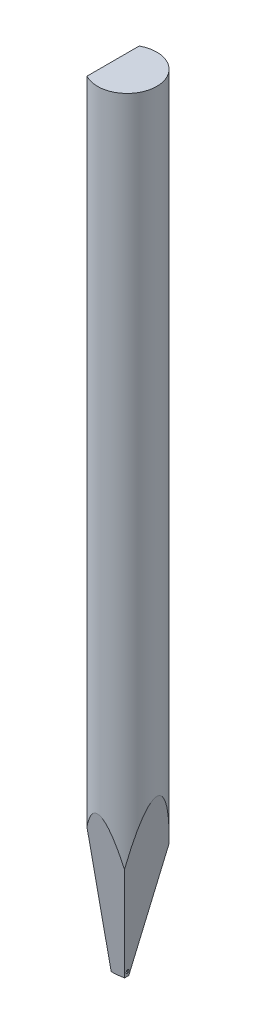
ISO-10303-21;
HEADER;
FILE_DESCRIPTION(('STEP AP214'),'2;1');
FILE_NAME('part.step','',(''),(''),'','','');
FILE_SCHEMA(('AUTOMOTIVE_DESIGN { 1 0 10303 214 1 1 1 1 }'));
ENDSEC;
DATA;
#1=APPLICATION_CONTEXT('core data for automotive mechanical design processes');
#2=APPLICATION_PROTOCOL_DEFINITION('international standard','automotive_design',2000,#1);
#3=PRODUCT_CONTEXT('',#1,'mechanical');
#4=PRODUCT('Part','Part','',(#3));
#5=PRODUCT_RELATED_PRODUCT_CATEGORY('part','',(#4));
#6=PRODUCT_DEFINITION_FORMATION('','',#4);
#7=PRODUCT_DEFINITION_CONTEXT('part definition',#1,'design');
#8=PRODUCT_DEFINITION('design','',#6,#7);
#9=PRODUCT_DEFINITION_SHAPE('','',#8);
#10=(LENGTH_UNIT() NAMED_UNIT(*) SI_UNIT(.MILLI.,.METRE.));
#11=(NAMED_UNIT(*) PLANE_ANGLE_UNIT() SI_UNIT($,.RADIAN.));
#12=(NAMED_UNIT(*) SI_UNIT($,.STERADIAN.) SOLID_ANGLE_UNIT());
#13=UNCERTAINTY_MEASURE_WITH_UNIT(LENGTH_MEASURE(1.E-05),#10,'distance_accuracy_value','');
#14=(GEOMETRIC_REPRESENTATION_CONTEXT(3) GLOBAL_UNCERTAINTY_ASSIGNED_CONTEXT((#13)) GLOBAL_UNIT_ASSIGNED_CONTEXT((#10,
#11,#12)) REPRESENTATION_CONTEXT('',''));
#15=CARTESIAN_POINT('',(0.,0.,0.));
#16=DIRECTION('',(0.,0.,1.));
#17=DIRECTION('',(1.,0.,0.));
#18=AXIS2_PLACEMENT_3D('',#15,#16,#17);
#19=CARTESIAN_POINT('',(26.8738719491216,0.,0.0508));
#20=DIRECTION('',(0.,-0.173648177666931,0.984807753012208));
#21=DIRECTION('',(0.,-0.984807753012208,-0.173648177666931));
#22=AXIS2_PLACEMENT_3D('',#19,#20,#21);
#23=PLANE('',#22);
#24=CARTESIAN_POINT('',(-0.35052,0.0254,0.0552787053099968));
#25=DIRECTION('',(0.,-0.173648177666931,0.984807753012208));
#26=DIRECTION('',(0.,-0.984807753012208,-0.173648177666931));
#27=AXIS2_PLACEMENT_3D('',#24,#25,#26);
#28=ELLIPSE('',#27,0.0257918359418979,0.0254);
#29=CARTESIAN_POINT('',(-0.35052,0.,0.0508000000000018));
#30=VERTEX_POINT('',#29);
#31=CARTESIAN_POINT('',(-0.37592,0.0254,0.0552787053099968));
#32=VERTEX_POINT('',#31);
#33=EDGE_CURVE('E204',#30,#32,#28,.F.);
#34=ORIENTED_EDGE('',*,*,#33,.F.);
#35=DIRECTION('',(-1.,0.,0.));
#36=VECTOR('',#35,1.);
#37=CARTESIAN_POINT('',(26.8738719491216,0.,0.0508));
#38=LINE('',#37,#36);
#39=CARTESIAN_POINT('',(-0.274319999999996,0.,0.0508000000000001));
#40=VERTEX_POINT('',#39);
#41=EDGE_CURVE('E268',#40,#30,#38,.T.);
#42=ORIENTED_EDGE('',*,*,#41,.F.);
#43=DIRECTION('',(-0.98997002855162,-0.139131214142995,-0.0245325869121374));
#44=VECTOR('',#43,1.);
#45=CARTESIAN_POINT('',(26.3320118858664,3.73927609160853,0.710135263268685));
#46=LINE('',#45,#44);
#47=CARTESIAN_POINT('',(-0.0138656438636779,0.0366044726132731,0.0572543561363243));
#48=VERTEX_POINT('',#47);
#49=EDGE_CURVE('E265',#48,#40,#46,.T.);
#50=ORIENTED_EDGE('',*,*,#49,.F.);
#51=DIRECTION('',(-0.171087869746036,-0.970287525247814,-0.171087869746036));
#52=VECTOR('',#51,1.);
#53=CARTESIAN_POINT('',(0.766901483986011,4.46455489014234,0.838021483986017));
#54=LINE('',#53,#52);
#55=CARTESIAN_POINT('',(0.523678555180163,3.08516911589156,0.594798555180167));
#56=VERTEX_POINT('',#55);
#57=EDGE_CURVE('E262',#56,#48,#54,.T.);
#58=ORIENTED_EDGE('',*,*,#57,.F.);
#59=CARTESIAN_POINT('',(0.,-0.288101116436578,0.));
#60=DIRECTION('',(0.,-0.173648177666931,0.984807753012208));
#61=DIRECTION('',(0.,-0.984807753012208,-0.173648177666931));
#62=AXIS2_PLACEMENT_3D('',#59,#60,#61);
#63=ELLIPSE('',#62,4.56371043248163,0.792479999999998);
#64=CARTESIAN_POINT('',(-0.37592,3.66844093071415,0.69764511322018));
#65=VERTEX_POINT('',#64);
#66=EDGE_CURVE('E273',#56,#65,#63,.T.);
#67=ORIENTED_EDGE('',*,*,#66,.T.);
#68=DIRECTION('',(0.,0.984807753012208,0.173648177666931));
#69=VECTOR('',#68,1.);
#70=CARTESIAN_POINT('',(-0.37592,20.251112252608,3.62161747949059));
#71=LINE('',#70,#69);
#72=EDGE_CURVE('E287',#32,#65,#71,.T.);
#73=ORIENTED_EDGE('',*,*,#72,.F.);
#74=EDGE_LOOP('',(#34,#42,#50,#58,#67,#73));
#75=FACE_BOUND('',#74,.T.);
#76=ADVANCED_FACE('F46',(#75),#23,.T.);
#77=CARTESIAN_POINT('',(26.8738719491216,0.,-0.0508));
#78=DIRECTION('',(0.,-0.173648177666931,-0.984807753012208));
#79=DIRECTION('',(0.,0.984807753012208,-0.173648177666931));
#80=AXIS2_PLACEMENT_3D('',#77,#78,#79);
#81=PLANE('',#80);
#82=CARTESIAN_POINT('',(-0.35052,0.0254,-0.0552787053099968));
#83=DIRECTION('',(0.,-0.173648177666931,-0.984807753012208));
#84=DIRECTION('',(0.,0.984807753012208,-0.173648177666931));
#85=AXIS2_PLACEMENT_3D('',#82,#83,#84);
#86=ELLIPSE('',#85,0.0257918359418979,0.0254);
#87=CARTESIAN_POINT('',(-0.37592,0.0254,-0.0552787053099968));
#88=VERTEX_POINT('',#87);
#89=CARTESIAN_POINT('',(-0.35052,0.,-0.0508000000000018));
#90=VERTEX_POINT('',#89);
#91=EDGE_CURVE('E201',#88,#90,#86,.F.);
#92=ORIENTED_EDGE('',*,*,#91,.F.);
#93=DIRECTION('',(0.,-0.984807753012208,0.173648177666931));
#94=VECTOR('',#93,1.);
#95=CARTESIAN_POINT('',(-0.37592,20.5255765703836,-3.67001294395617));
#96=LINE('',#95,#94);
#97=CARTESIAN_POINT('',(-0.37592,3.66844093071414,-0.69764511322018));
#98=VERTEX_POINT('',#97);
#99=EDGE_CURVE('E193',#98,#88,#96,.T.);
#100=ORIENTED_EDGE('',*,*,#99,.F.);
#101=CARTESIAN_POINT('',(0.,-0.288101116436578,0.));
#102=DIRECTION('',(0.,-0.173648177666931,-0.984807753012208));
#103=DIRECTION('',(0.,-0.984807753012208,0.173648177666931));
#104=AXIS2_PLACEMENT_3D('',#101,#102,#103);
#105=ELLIPSE('',#104,4.56371043248163,0.792479999999998);
#106=CARTESIAN_POINT('',(0.523678555180163,3.08516911589156,-0.594798555180167));
#107=VERTEX_POINT('',#106);
#108=EDGE_CURVE('E276',#98,#107,#105,.T.);
#109=ORIENTED_EDGE('',*,*,#108,.T.);
#110=DIRECTION('',(0.171087869746036,0.970287525247814,-0.171087869746036));
#111=VECTOR('',#110,1.);
#112=CARTESIAN_POINT('',(0.766901483986011,4.46455489014234,-0.838021483986017));
#113=LINE('',#112,#111);
#114=CARTESIAN_POINT('',(-0.0138656438636779,0.0366044726132731,-0.0572543561363243));
#115=VERTEX_POINT('',#114);
#116=EDGE_CURVE('E290',#115,#107,#113,.T.);
#117=ORIENTED_EDGE('',*,*,#116,.F.);
#118=DIRECTION('',(0.98997002855162,0.139131214142995,-0.0245325869121374));
#119=VECTOR('',#118,1.);
#120=CARTESIAN_POINT('',(26.3320118858664,3.73927609160853,-0.710135263268685));
#121=LINE('',#120,#119);
#122=CARTESIAN_POINT('',(-0.274319999999996,0.,-0.0508000000000001));
#123=VERTEX_POINT('',#122);
#124=EDGE_CURVE('E293',#123,#115,#121,.T.);
#125=ORIENTED_EDGE('',*,*,#124,.F.);
#126=DIRECTION('',(-1.,0.,0.));
#127=VECTOR('',#126,1.);
#128=CARTESIAN_POINT('',(26.8738719491216,0.,-0.0508));
#129=LINE('',#128,#127);
#130=EDGE_CURVE('E270',#123,#90,#129,.T.);
#131=ORIENTED_EDGE('',*,*,#130,.T.);
#132=EDGE_LOOP('',(#92,#100,#109,#117,#125,#131));
#133=FACE_BOUND('',#132,.T.);
#134=ADVANCED_FACE('F382',(#133),#81,.T.);
#135=CARTESIAN_POINT('',(-0.27432,0.,27.2760283406468));
#136=DIRECTION('',(-0.139173100960066,0.99026806874157,0.));
#137=DIRECTION('',(-0.99026806874157,-0.139173100960066,0.));
#138=AXIS2_PLACEMENT_3D('',#135,#136,#137);
#139=PLANE('',#138);
#140=DIRECTION('',(-0.99026806874157,-0.139173100960066,0.));
#141=VECTOR('',#140,1.);
#142=CARTESIAN_POINT('',(-0.27432,0.,0.0253999999999983));
#143=LINE('',#142,#141);
#144=CARTESIAN_POINT('',(-0.145800064,0.018062299081338,0.0253999999999992));
#145=VERTEX_POINT('',#144);
#146=CARTESIAN_POINT('',(-0.254691435266474,0.00275861487165988,0.0254));
#147=VERTEX_POINT('',#146);
#148=EDGE_CURVE('E248',#145,#147,#143,.T.);
#149=ORIENTED_EDGE('',*,*,#148,.F.);
#150=DIRECTION('',(0.,0.,1.));
#151=VECTOR('',#150,1.);
#152=CARTESIAN_POINT('',(-0.145800064,0.018062299081338,27.2760283406468));
#153=LINE('',#152,#151);
#154=CARTESIAN_POINT('',(-0.145800064,0.018062299081338,-0.0253999999999992));
#155=VERTEX_POINT('',#154);
#156=EDGE_CURVE('E304',#155,#145,#153,.T.);
#157=ORIENTED_EDGE('',*,*,#156,.F.);
#158=DIRECTION('',(-0.99026806874157,-0.139173100960066,0.));
#159=VECTOR('',#158,1.);
#160=CARTESIAN_POINT('',(-0.27432,0.,-0.0253999999999983));
#161=LINE('',#160,#159);
#162=CARTESIAN_POINT('',(-0.254691435266474,0.00275861487165988,-0.0254));
#163=VERTEX_POINT('',#162);
#164=EDGE_CURVE('E244',#155,#163,#161,.T.);
#165=ORIENTED_EDGE('',*,*,#164,.T.);
#166=CARTESIAN_POINT('',(-2.43404817183527,-0.30353,0.));
#167=DIRECTION('',(-0.139173100960066,0.99026806874157,0.));
#168=DIRECTION('',(-0.99026806874157,-0.139173100960066,0.));
#169=AXIS2_PLACEMENT_3D('',#166,#167,#168);
#170=ELLIPSE('',#169,2.20832903686027,0.30734);
#171=CARTESIAN_POINT('',(-0.27432,0.,-0.0482432865795759));
#172=VERTEX_POINT('',#171);
#173=EDGE_CURVE('E296',#163,#172,#170,.T.);
#174=ORIENTED_EDGE('',*,*,#173,.T.);
#175=DIRECTION('',(0.,0.,-1.));
#176=VECTOR('',#175,1.);
#177=CARTESIAN_POINT('',(-0.27432,0.,27.2760283406468));
#178=LINE('',#177,#176);
#179=EDGE_CURVE('E254',#172,#123,#178,.T.);
#180=ORIENTED_EDGE('',*,*,#179,.T.);
#181=ORIENTED_EDGE('',*,*,#124,.T.);
#182=DIRECTION('',(0.,0.,-1.));
#183=VECTOR('',#182,1.);
#184=CARTESIAN_POINT('',(-0.0138656438636759,0.036604472613273,27.2760283406468));
#185=LINE('',#184,#183);
#186=EDGE_CURVE('E251',#48,#115,#185,.T.);
#187=ORIENTED_EDGE('',*,*,#186,.F.);
#188=ORIENTED_EDGE('',*,*,#49,.T.);
#189=CARTESIAN_POINT('',(-0.274320000000002,0.,0.0482432865795852));
#190=VERTEX_POINT('',#189);
#191=EDGE_CURVE('E256',#40,#190,#178,.T.);
#192=ORIENTED_EDGE('',*,*,#191,.T.);
#193=EDGE_CURVE('E297',#190,#147,#170,.T.);
#194=ORIENTED_EDGE('',*,*,#193,.T.);
#195=EDGE_LOOP('',(#149,#157,#165,#174,#180,#181,#187,#188,#192,#194));
#196=FACE_BOUND('',#195,.T.);
#197=ADVANCED_FACE('F329',(#196),#139,.F.);
#198=CARTESIAN_POINT('',(26.7468719491216,-0.30353,0.));
#199=DIRECTION('',(-1.,0.,0.));
#200=DIRECTION('',(0.,0.,1.));
#201=AXIS2_PLACEMENT_3D('',#198,#199,#200);
#202=CYLINDRICAL_SURFACE('',#201,0.30734);
#203=DIRECTION('',(-1.,0.,0.));
#204=VECTOR('',#203,1.);
#205=CARTESIAN_POINT('',(26.7468719491216,0.,0.0482432865795852));
#206=LINE('',#205,#204);
#207=CARTESIAN_POINT('',(-0.35052,0.,0.0482432865795858));
#208=VERTEX_POINT('',#207);
#209=EDGE_CURVE('E303',#190,#208,#206,.T.);
#210=ORIENTED_EDGE('',*,*,#209,.T.);
#211=CARTESIAN_POINT('',(-0.35052,0.,0.0482432865795852));
#212=CARTESIAN_POINT('',(-0.350767913301096,-1.19542843772803E-07,0.0482439866555444));
#213=CARTESIAN_POINT('',(-0.351014861392933,3.62470794984307E-06,0.0482204837583812));
#214=CARTESIAN_POINT('',(-0.351497824475882,1.77257610530701E-05,0.048131663550789));
#215=CARTESIAN_POINT('',(-0.351733938449228,2.79980345508259E-05,0.0480668807295799));
#216=CARTESIAN_POINT('',(-0.352256326088675,5.77005969758154E-05,0.0478789541586123));
#217=CARTESIAN_POINT('',(-0.352538394385228,7.88787351782238E-05,0.0477446199469163));
#218=CARTESIAN_POINT('',(-0.353078295346921,0.000127703558985932,0.0474331108524059));
#219=CARTESIAN_POINT('',(-0.353335984553503,0.000155385552449527,0.0472557019452807));
#220=CARTESIAN_POINT('',(-0.35400174233734,0.00023617459435752,0.0467343071530912));
#221=CARTESIAN_POINT('',(-0.354386489991853,0.000293366747035686,0.04636155839518));
#222=CARTESIAN_POINT('',(-0.355098951579075,0.000413574680164901,0.0455669319559007));
#223=CARTESIAN_POINT('',(-0.355426537167256,0.000476603091413842,0.0451449471799639));
#224=CARTESIAN_POINT('',(-0.356612086855196,0.000724574718518854,0.0434579803018295));
#225=CARTESIAN_POINT('',(-0.357318341338528,0.000917424822642028,0.0420900984298448));
#226=CARTESIAN_POINT('',(-0.358546499103955,0.00129385703696121,0.0392733364497388));
#227=CARTESIAN_POINT('',(-0.359067131306756,0.0014773681362723,0.0378239736931028));
#228=CARTESIAN_POINT('',(-0.361082963556255,0.00223677886764504,0.0314441024489423));
#229=CARTESIAN_POINT('',(-0.361998491462294,0.00272303861932352,0.0263250556700738));
#230=CARTESIAN_POINT('',(-0.363287466260708,0.00343648568054079,0.0160225561821279));
#231=CARTESIAN_POINT('',(-0.363659578270333,0.0036630347273081,0.0108389763129056));
#232=CARTESIAN_POINT('',(-0.363972985043323,0.00385330138614358,0.000449493392470492));
#233=CARTESIAN_POINT('',(-0.363914353724792,0.00381706409391508,-0.00475640567539981));
#234=CARTESIAN_POINT('',(-0.363359645903479,0.00348101396992523,-0.0151346555748545));
#235=CARTESIAN_POINT('',(-0.362863906204434,0.00318140407436096,-0.0203070291482792));
#236=CARTESIAN_POINT('',(-0.361587863461915,0.00253284401461739,-0.0281196828661227));
#237=CARTESIAN_POINT('',(-0.361052170464876,0.0022738659867185,-0.0308032472057407));
#238=CARTESIAN_POINT('',(-0.359879874536839,0.00178202258087802,-0.0352985409759539));
#239=CARTESIAN_POINT('',(-0.359320212463211,0.00156415994286779,-0.0371329765625637));
#240=CARTESIAN_POINT('',(-0.357915449615104,0.00108653420359569,-0.0408693960879428));
#241=CARTESIAN_POINT('',(-0.3570519058511,0.000824845821217691,-0.0427659366927652));
#242=CARTESIAN_POINT('',(-0.355666955135482,0.000526022910364276,-0.0448100132221557));
#243=CARTESIAN_POINT('',(-0.355427139387419,0.000477218188454204,-0.0451397061499097));
#244=CARTESIAN_POINT('',(-0.354916645564511,0.00038202095342617,-0.0457761949331125));
#245=CARTESIAN_POINT('',(-0.354645904201855,0.000335633680386315,-0.046082941629228));
#246=CARTESIAN_POINT('',(-0.354064289185953,0.000246758191854156,-0.046665244521223));
#247=CARTESIAN_POINT('',(-0.353752942125983,0.000204328109509145,-0.0469403464238046));
#248=CARTESIAN_POINT('',(-0.353086480397482,0.000127793869631165,-0.0474329155161114));
#249=CARTESIAN_POINT('',(-0.352731561443898,9.36543940562352E-05,-0.0476506275388426));
#250=CARTESIAN_POINT('',(-0.352132978988963,5.02841505678784E-05,-0.0479259603811109));
#251=CARTESIAN_POINT('',(-0.351903112512649,3.65754200289388E-05,-0.0480126464944021));
#252=CARTESIAN_POINT('',(-0.351432234922708,1.53075235908591E-05,-0.0481469291864184));
#253=CARTESIAN_POINT('',(-0.351191258260106,7.73054276230474E-06,-0.0481946390090931));
#254=CARTESIAN_POINT('',(-0.350805892270728,1.19685939597785E-06,-0.0482357533750439));
#255=CARTESIAN_POINT('',(-0.350662956582406,-3.31045745205668E-08,-0.0482434827775498));
#256=CARTESIAN_POINT('',(-0.35052,0.,-0.0482432865795856));
#257=B_SPLINE_CURVE_WITH_KNOTS('',3,(#211,#212,#213,#214,#215,#216,#217,#218,#219,#220,#221,
#222,#223,#224,#225,#226,#227,#228,#229,#230,#231,#232,#233,#234,#235,#236,#237,#238,#239,#240,
#241,#242,#243,#244,#245,#246,#247,#248,#249,#250,#251,#252,#253,#254,#255,#256),.UNSPECIFIED.,
.F.,.F.,(4,2,2,2,2,2,2,2,2,2,2,2,2,2,2,2,2,2,2,2,2,2,4),(0.,0.000741043318305486,
0.00147268140779397,0.00240682725086805,0.00334616655924916,0.00495326023235424,
0.00656391709747215,0.0111818210055972,0.0158307654682357,0.0313880221471822,0.0469834307890158,
0.0625761632290354,0.0781568915394422,0.0863865542979192,0.0921775559520869,0.0984081610414817,
0.0996385359491797,0.100871475463076,0.102120347956776,0.103363803055068,0.104099176293444,
0.104832405260387,0.105261095012052),.UNSPECIFIED.);
#258=CARTESIAN_POINT('',(-0.361394986445845,0.00245148621527588,0.0288612599442385));
#259=VERTEX_POINT('',#258);
#260=EDGE_CURVE('E202',#208,#259,#257,.T.);
#261=ORIENTED_EDGE('',*,*,#260,.T.);
#262=CARTESIAN_POINT('',(-0.37592,0.,-0.0482432865795854));
#263=CARTESIAN_POINT('',(-0.363217772431748,0.00253447256157342,-0.0322972656685655));
#264=CARTESIAN_POINT('',(-0.35052,0.00380999999999999,-0.0161478491107738));
#265=CARTESIAN_POINT('',(-0.35052,0.00380999999999997,0.0161478491107741));
#266=CARTESIAN_POINT('',(-0.363217772431748,0.00253447256157349,0.0322972656685651));
#267=CARTESIAN_POINT('',(-0.37592,0.,0.0482432865795852));
#268=(BOUNDED_CURVE() B_SPLINE_CURVE(3,(#262,#263,#264,#265,#266,#267),.UNSPECIFIED.,.F.,
.F.) B_SPLINE_CURVE_WITH_KNOTS((4,2,4),(1.41317404265068,1.5707963267949,1.72841861093912),
.UNSPECIFIED.) CURVE() GEOMETRIC_REPRESENTATION_ITEM() RATIONAL_B_SPLINE_CURVE((1.,1.,1.,1.,1.,1.)) REPRESENTATION_ITEM(''));
#269=CARTESIAN_POINT('',(-0.361394935619562,0.00245148328491557,-0.0288612910505774));
#270=VERTEX_POINT('',#269);
#271=EDGE_CURVE('E185',#259,#270,#268,.F.);
#272=ORIENTED_EDGE('',*,*,#271,.T.);
#273=CARTESIAN_POINT('',(-0.35052,0.,-0.0482432865795858));
#274=VERTEX_POINT('',#273);
#275=EDGE_CURVE('E79',#270,#274,#257,.T.);
#276=ORIENTED_EDGE('',*,*,#275,.T.);
#277=DIRECTION('',(-1.,0.,0.));
#278=VECTOR('',#277,1.);
#279=CARTESIAN_POINT('',(26.7468719491216,0.,-0.0482432865795852));
#280=LINE('',#279,#278);
#281=EDGE_CURVE('E255',#172,#274,#280,.T.);
#282=ORIENTED_EDGE('',*,*,#281,.F.);
#283=ORIENTED_EDGE('',*,*,#173,.F.);
#284=DIRECTION('',(-1.,0.,0.));
#285=VECTOR('',#284,1.);
#286=CARTESIAN_POINT('',(26.7468719491216,0.00275861487165988,-0.0254));
#287=LINE('',#286,#285);
#288=CARTESIAN_POINT('',(-0.27701705287362,0.00275861487165889,-0.0254));
#289=VERTEX_POINT('',#288);
#290=EDGE_CURVE('E300',#163,#289,#287,.T.);
#291=ORIENTED_EDGE('',*,*,#290,.T.);
#292=CARTESIAN_POINT('',(-0.277017052875006,0.00275861487165987,0.0254));
#293=CARTESIAN_POINT('',(-0.284442218380963,0.00218353327813892,0.0323346828629024));
#294=CARTESIAN_POINT('',(-0.295721808947173,0.00205890636051981,0.0331150533713508));
#295=CARTESIAN_POINT('',(-0.315237407128583,0.00294829307885841,0.023499836635067));
#296=CARTESIAN_POINT('',(-0.323269473701259,0.00381582760070104,0.0120142630280613));
#297=CARTESIAN_POINT('',(-0.323181572117124,0.00380410097188941,-0.0123105905409841));
#298=CARTESIAN_POINT('',(-0.315154489363352,0.00293776360358423,-0.0236340001899681));
#299=CARTESIAN_POINT('',(-0.295544211471413,0.00204709092987491,-0.0332219444343139));
#300=CARTESIAN_POINT('',(-0.284400902139005,0.00218569918925042,-0.0323085649922618));
#301=CARTESIAN_POINT('',(-0.277017052873619,0.00275861487165989,-0.0254));
#302=(BOUNDED_CURVE() B_SPLINE_CURVE(3,(#292,#293,#294,#295,#296,#297,#298,#299,#300,#301),
.UNSPECIFIED.,.F.,.F.) B_SPLINE_CURVE_WITH_KNOTS((4,2,2,2,4),(0.,2.2052188416809E-05,
4.41043768336174E-05,6.61565652504259E-05,8.82087536672343E-05),
.UNSPECIFIED.) CURVE() GEOMETRIC_REPRESENTATION_ITEM() RATIONAL_B_SPLINE_CURVE((1.,1.,1.,1.,1.,
1.,1.,1.,1.,1.)) REPRESENTATION_ITEM(''));
#303=CARTESIAN_POINT('',(-0.27701705287362,0.00275861487165927,0.0254));
#304=VERTEX_POINT('',#303);
#305=EDGE_CURVE('E306',#289,#304,#302,.F.);
#306=ORIENTED_EDGE('',*,*,#305,.T.);
#307=DIRECTION('',(-1.,0.,0.));
#308=VECTOR('',#307,1.);
#309=CARTESIAN_POINT('',(26.7468719491216,0.00275861487165988,0.0254));
#310=LINE('',#309,#308);
#311=EDGE_CURVE('E307',#147,#304,#310,.T.);
#312=ORIENTED_EDGE('',*,*,#311,.F.);
#313=ORIENTED_EDGE('',*,*,#193,.F.);
#314=EDGE_LOOP('',(#210,#261,#272,#276,#282,#283,#291,#306,#312,#313));
#315=FACE_BOUND('',#314,.T.);
#316=ADVANCED_FACE('F318',(#315),#202,.F.);
#317=CARTESIAN_POINT('',(0.,0.,0.));
#318=DIRECTION('',(0.,1.,0.));
#319=DIRECTION('',(0.,0.,1.));
#320=AXIS2_PLACEMENT_3D('',#317,#318,#319);
#321=PLANE('',#320);
#322=ORIENTED_EDGE('',*,*,#41,.T.);
#323=DIRECTION('',(0.,0.,-1.));
#324=VECTOR('',#323,1.);
#325=CARTESIAN_POINT('',(-0.35052,0.,26.4422911070088));
#326=LINE('',#325,#324);
#327=EDGE_CURVE('E71',#30,#208,#326,.T.);
#328=ORIENTED_EDGE('',*,*,#327,.T.);
#329=ORIENTED_EDGE('',*,*,#209,.F.);
#330=ORIENTED_EDGE('',*,*,#191,.F.);
#331=EDGE_LOOP('',(#322,#328,#329,#330));
#332=FACE_BOUND('',#331,.T.);
#333=ADVANCED_FACE('F328',(#332),#321,.F.);
#334=ORIENTED_EDGE('',*,*,#281,.T.);
#335=EDGE_CURVE('E200',#274,#90,#326,.T.);
#336=ORIENTED_EDGE('',*,*,#335,.T.);
#337=ORIENTED_EDGE('',*,*,#130,.F.);
#338=ORIENTED_EDGE('',*,*,#179,.F.);
#339=EDGE_LOOP('',(#334,#336,#337,#338));
#340=FACE_BOUND('',#339,.T.);
#341=ADVANCED_FACE('F387',(#340),#321,.F.);
#342=CARTESIAN_POINT('',(0.,21.0312,0.));
#343=DIRECTION('',(0.,-1.,0.));
#344=DIRECTION('',(0.,0.,-1.));
#345=AXIS2_PLACEMENT_3D('',#342,#343,#344);
#346=CYLINDRICAL_SURFACE('',#345,0.792479999999998);
#347=ORIENTED_EDGE('',*,*,#66,.F.);
#348=CARTESIAN_POINT('',(0.,0.115240446574634,0.));
#349=DIRECTION('',(-0.984807753012208,0.173648177666931,0.));
#350=DIRECTION('',(-0.173648177666931,-0.984807753012208,0.));
#351=AXIS2_PLACEMENT_3D('',#348,#349,#350);
#352=ELLIPSE('',#351,4.56371043248165,0.792479999999998);
#353=EDGE_CURVE('E259',#56,#107,#352,.T.);
#354=ORIENTED_EDGE('',*,*,#353,.T.);
#355=ORIENTED_EDGE('',*,*,#108,.F.);
#356=DIRECTION('',(0.,-1.,0.));
#357=VECTOR('',#356,1.);
#358=CARTESIAN_POINT('',(-0.37592,21.0312,-0.69764511322018));
#359=LINE('',#358,#357);
#360=CARTESIAN_POINT('',(-0.37592,21.0312,-0.69764511322018));
#361=VERTEX_POINT('',#360);
#362=EDGE_CURVE('E282',#361,#98,#359,.T.);
#363=ORIENTED_EDGE('',*,*,#362,.F.);
#364=CARTESIAN_POINT('',(0.,21.0312,0.));
#365=DIRECTION('',(0.,1.,0.));
#366=DIRECTION('',(0.,0.,1.));
#367=AXIS2_PLACEMENT_3D('',#364,#365,#366);
#368=CIRCLE('',#367,0.792479999999998);
#369=CARTESIAN_POINT('',(-0.37592,21.0312,0.69764511322018));
#370=VERTEX_POINT('',#369);
#371=EDGE_CURVE('E284',#370,#361,#368,.T.);
#372=ORIENTED_EDGE('',*,*,#371,.F.);
#373=DIRECTION('',(0.,-1.,0.));
#374=VECTOR('',#373,1.);
#375=CARTESIAN_POINT('',(-0.37592,21.0312,0.69764511322018));
#376=LINE('',#375,#374);
#377=EDGE_CURVE('E280',#65,#370,#376,.F.);
#378=ORIENTED_EDGE('',*,*,#377,.F.);
#379=EDGE_LOOP('',(#347,#354,#355,#363,#372,#378));
#380=FACE_BOUND('',#379,.T.);
#381=ADVANCED_FACE('F381',(#380),#346,.T.);
#382=CARTESIAN_POINT('',(-0.37592,21.0312,-0.80247998));
#383=DIRECTION('',(-1.,0.,0.));
#384=DIRECTION('',(0.,0.,1.));
#385=AXIS2_PLACEMENT_3D('',#382,#383,#384);
#386=PLANE('',#385);
#387=DIRECTION('',(0.,0.,-1.));
#388=VECTOR('',#387,1.);
#389=CARTESIAN_POINT('',(-0.37592,0.0254,26.4422911070088));
#390=LINE('',#389,#388);
#391=CARTESIAN_POINT('',(-0.37592,0.0253965728299479,0.0162828578856257));
#392=VERTEX_POINT('',#391);
#393=EDGE_CURVE('E196',#32,#392,#390,.T.);
#394=ORIENTED_EDGE('',*,*,#393,.F.);
#395=ORIENTED_EDGE('',*,*,#72,.T.);
#396=ORIENTED_EDGE('',*,*,#377,.T.);
#397=DIRECTION('',(0.,0.,-1.));
#398=VECTOR('',#397,1.);
#399=CARTESIAN_POINT('',(-0.37592,21.0312,-0.80247998));
#400=LINE('',#399,#398);
#401=EDGE_CURVE('E278',#370,#361,#400,.T.);
#402=ORIENTED_EDGE('',*,*,#401,.T.);
#403=ORIENTED_EDGE('',*,*,#362,.T.);
#404=ORIENTED_EDGE('',*,*,#99,.T.);
#405=CARTESIAN_POINT('',(-0.37592,0.0254,-0.0160570095759892));
#406=VERTEX_POINT('',#405);
#407=EDGE_CURVE('E190',#406,#88,#390,.T.);
#408=ORIENTED_EDGE('',*,*,#407,.F.);
#409=CARTESIAN_POINT('',(-0.37592,0.,0.0482432865795852));
#410=CARTESIAN_POINT('',(-0.37592,0.0149574693246277,0.0344039161936227));
#411=CARTESIAN_POINT('',(-0.37592,0.0292099999999983,0.0174815349681417));
#412=CARTESIAN_POINT('',(-0.37592,0.0292099999999983,-0.0174815349681413));
#413=CARTESIAN_POINT('',(-0.37592,0.0149574693246281,-0.0344039161936234));
#414=CARTESIAN_POINT('',(-0.37592,0.,-0.0482432865795854));
#415=(BOUNDED_CURVE() B_SPLINE_CURVE(3,(#409,#410,#411,#412,#413,#414),.UNSPECIFIED.,.F.,
.F.) B_SPLINE_CURVE_WITH_KNOTS((4,2,4),(1.41317404265068,1.5707963267949,1.72841861093912),
.UNSPECIFIED.) CURVE() GEOMETRIC_REPRESENTATION_ITEM() RATIONAL_B_SPLINE_CURVE((1.,1.,1.,1.,1.,1.)) REPRESENTATION_ITEM(''));
#416=EDGE_CURVE('E178',#406,#392,#415,.F.);
#417=ORIENTED_EDGE('',*,*,#416,.T.);
#418=EDGE_LOOP('',(#394,#395,#396,#402,#403,#404,#408,#417));
#419=FACE_BOUND('',#418,.T.);
#420=ADVANCED_FACE('F191',(#419),#386,.T.);
#421=CARTESIAN_POINT('',(0.,21.0312,0.));
#422=DIRECTION('',(0.,1.,0.));
#423=DIRECTION('',(0.,0.,1.));
#424=AXIS2_PLACEMENT_3D('',#421,#422,#423);
#425=PLANE('',#424);
#426=ORIENTED_EDGE('',*,*,#371,.T.);
#427=ORIENTED_EDGE('',*,*,#401,.F.);
#428=EDGE_LOOP('',(#426,#427));
#429=FACE_BOUND('',#428,.T.);
#430=ADVANCED_FACE('F380',(#429),#425,.T.);
#431=CARTESIAN_POINT('',(-0.0138656438636759,0.036604472613273,27.2760283406468));
#432=DIRECTION('',(-0.984807753012208,0.173648177666931,0.));
#433=DIRECTION('',(-0.173648177666931,-0.984807753012208,0.));
#434=AXIS2_PLACEMENT_3D('',#431,#432,#433);
#435=PLANE('',#434);
#436=CARTESIAN_POINT('',(0.00997913420261825,0.171834928953466,0.));
#437=DIRECTION('',(-0.984807753012208,0.173648177666931,0.));
#438=DIRECTION('',(0.173648177666931,0.984807753012208,0.));
#439=AXIS2_PLACEMENT_3D('',#436,#437,#438);
#440=ELLIPSE('',#439,0.0515734368592615,0.0370444608655554);
#441=CARTESIAN_POINT('',(0.0189347675292495,0.222624849421952,0.));
#442=VERTEX_POINT('',#441);
#443=EDGE_CURVE('E250',#442,#442,#440,.F.);
#444=ORIENTED_EDGE('',*,*,#443,.F.);
#445=EDGE_LOOP('',(#444));
#446=FACE_BOUND('',#445,.T.);
#447=ORIENTED_EDGE('',*,*,#353,.F.);
#448=ORIENTED_EDGE('',*,*,#57,.T.);
#449=ORIENTED_EDGE('',*,*,#186,.T.);
#450=ORIENTED_EDGE('',*,*,#116,.T.);
#451=EDGE_LOOP('',(#447,#448,#449,#450));
#452=FACE_BOUND('',#451,.T.);
#453=ADVANCED_FACE('F334',(#446,#452),#435,.F.);
#454=CARTESIAN_POINT('',(-0.145800064,0.0660400000000001,0.0254));
#455=DIRECTION('',(-1.,0.,0.));
#456=DIRECTION('',(0.,0.,1.));
#457=AXIS2_PLACEMENT_3D('',#454,#455,#456);
#458=PLANE('',#457);
#459=ORIENTED_EDGE('',*,*,#156,.T.);
#460=DIRECTION('',(0.,1.,0.));
#461=VECTOR('',#460,1.);
#462=CARTESIAN_POINT('',(-0.145800064,0.0660400000000001,0.0254));
#463=LINE('',#462,#461);
#464=CARTESIAN_POINT('',(-0.145800064,0.0660400000000001,0.0254));
#465=VERTEX_POINT('',#464);
#466=EDGE_CURVE('E231',#145,#465,#463,.T.);
#467=ORIENTED_EDGE('',*,*,#466,.T.);
#468=DIRECTION('',(0.,0.,-1.));
#469=VECTOR('',#468,1.);
#470=CARTESIAN_POINT('',(-0.145800064,0.0660400000000001,0.0254));
#471=LINE('',#470,#469);
#472=CARTESIAN_POINT('',(-0.145800064,0.0660400000000001,0.02286));
#473=VERTEX_POINT('',#472);
#474=EDGE_CURVE('E238',#465,#473,#471,.T.);
#475=ORIENTED_EDGE('',*,*,#474,.T.);
#476=CARTESIAN_POINT('',(-0.145800064,0.0660400000000001,0.));
#477=DIRECTION('',(1.,0.,0.));
#478=DIRECTION('',(0.,1.,0.));
#479=AXIS2_PLACEMENT_3D('',#476,#477,#478);
#480=ELLIPSE('',#479,0.0263964543073496,0.02286);
#481=CARTESIAN_POINT('',(-0.145800064,0.0660400000000001,-0.0228599999999995));
#482=VERTEX_POINT('',#481);
#483=EDGE_CURVE('E224',#482,#473,#480,.F.);
#484=ORIENTED_EDGE('',*,*,#483,.F.);
#485=CARTESIAN_POINT('',(-0.145800064,0.0660400000000001,-0.0254));
#486=VERTEX_POINT('',#485);
#487=EDGE_CURVE('E234',#482,#486,#471,.T.);
#488=ORIENTED_EDGE('',*,*,#487,.T.);
#489=DIRECTION('',(0.,1.,0.));
#490=VECTOR('',#489,1.);
#491=CARTESIAN_POINT('',(-0.145800064,0.0660400000000001,-0.0254));
#492=LINE('',#491,#490);
#493=EDGE_CURVE('E232',#155,#486,#492,.T.);
#494=ORIENTED_EDGE('',*,*,#493,.F.);
#495=EDGE_LOOP('',(#459,#467,#475,#484,#488,#494));
#496=FACE_BOUND('',#495,.T.);
#497=ADVANCED_FACE('F493',(#496),#458,.T.);
#498=CARTESIAN_POINT('',(-0.0179613089676814,0.139847739630775,0.));
#499=DIRECTION('',(0.866025403784441,0.499999999999995,0.));
#500=DIRECTION('',(-0.499999999999995,0.866025403784441,0.));
#501=AXIS2_PLACEMENT_3D('',#498,#499,#500);
#502=CONICAL_SURFACE('',#501,0.02286,0.392699081698725);
#503=CARTESIAN_POINT('',(-0.0179613089676814,0.139847739630775,0.));
#504=DIRECTION('',(0.866025403784441,0.499999999999995,0.));
#505=DIRECTION('',(-0.499999999999995,0.866025403784441,0.));
#506=AXIS2_PLACEMENT_3D('',#503,#504,#505);
#507=CIRCLE('',#506,0.02286);
#508=CARTESIAN_POINT('',(-0.0293913089676813,0.159645080361287,0.));
#509=VERTEX_POINT('',#508);
#510=EDGE_CURVE('E218',#509,#509,#507,.T.);
#511=ORIENTED_EDGE('',*,*,#510,.F.);
#512=EDGE_LOOP('',(#511));
#513=FACE_BOUND('',#512,.T.);
#514=ORIENTED_EDGE('',*,*,#443,.T.);
#515=EDGE_LOOP('',(#514));
#516=FACE_BOUND('',#515,.T.);
#517=ADVANCED_FACE('F498',(#513,#516),#502,.F.);
#518=CARTESIAN_POINT('',(-0.229331108814043,0.0660400000000001,0.));
#519=DIRECTION('',(-0.601815023152052,-0.79863551004729,0.));
#520=DIRECTION('',(0.79863551004729,-0.601815023152052,0.));
#521=AXIS2_PLACEMENT_3D('',#518,#519,#520);
#522=CYLINDRICAL_SURFACE('',#521,0.0254);
#523=DIRECTION('',(-0.601815023152052,-0.79863551004729,0.));
#524=VECTOR('',#523,1.);
#525=CARTESIAN_POINT('',(-0.178012525826945,0.134142059805924,0.0254));
#526=LINE('',#525,#524);
#527=CARTESIAN_POINT('',(-0.229331108814043,0.0660400000000001,0.0254));
#528=VERTEX_POINT('',#527);
#529=EDGE_CURVE('E241',#528,#304,#526,.T.);
#530=ORIENTED_EDGE('',*,*,#529,.T.);
#531=CARTESIAN_POINT('',(-0.277017052873619,0.00275861487165989,-0.0254));
#532=CARTESIAN_POINT('',(-0.284244061303996,0.00955359045548847,-0.0253999999999998));
#533=CARTESIAN_POINT('',(-0.288953502486963,0.0122267813112386,-0.0212067281142526));
#534=CARTESIAN_POINT('',(-0.296456012010526,0.0154316354161662,-0.0120713465751505));
#535=CARTESIAN_POINT('',(-0.2988562452546,0.0159530703106764,-0.00615277010871756));
#536=CARTESIAN_POINT('',(-0.298910186632104,0.0159403631722948,0.00600471766987933));
#537=CARTESIAN_POINT('',(-0.296506419575357,0.0154186083573108,0.0119999269741193));
#538=CARTESIAN_POINT('',(-0.289083310129462,0.0122031663941623,0.0211370572112736));
#539=CARTESIAN_POINT('',(-0.284274428290388,0.00956911542143528,0.0253999999995684));
#540=CARTESIAN_POINT('',(-0.277017052875006,0.00275861487165987,0.0254));
#541=(BOUNDED_CURVE() B_SPLINE_CURVE(3,(#531,#532,#533,#534,#535,#536,#537,#538,#539,#540),
.UNSPECIFIED.,.F.,.F.) B_SPLINE_CURVE_WITH_KNOTS((4,2,2,2,4),(0.,2.2052188416809E-05,
4.41043768336174E-05,6.61565652504259E-05,8.82087536672343E-05),
.UNSPECIFIED.) CURVE() GEOMETRIC_REPRESENTATION_ITEM() RATIONAL_B_SPLINE_CURVE((1.,1.,1.,1.,1.,
1.,1.,1.,1.,1.)) REPRESENTATION_ITEM(''));
#542=EDGE_CURVE('E440',#304,#289,#541,.F.);
#543=ORIENTED_EDGE('',*,*,#542,.T.);
#544=DIRECTION('',(0.601815023152052,0.79863551004729,0.));
#545=VECTOR('',#544,1.);
#546=CARTESIAN_POINT('',(-0.229331108814043,0.0660400000000001,-0.0254));
#547=LINE('',#546,#545);
#548=CARTESIAN_POINT('',(-0.229331108814043,0.0660400000000001,-0.0254));
#549=VERTEX_POINT('',#548);
#550=EDGE_CURVE('E245',#289,#549,#547,.T.);
#551=ORIENTED_EDGE('',*,*,#550,.T.);
#552=CARTESIAN_POINT('',(-0.229331108814043,0.0660400000000001,0.));
#553=DIRECTION('',(0.,-1.,0.));
#554=DIRECTION('',(-1.,0.,0.));
#555=AXIS2_PLACEMENT_3D('',#552,#553,#554);
#556=ELLIPSE('',#555,0.0318042457171683,0.0254);
#557=EDGE_CURVE('E242',#549,#528,#556,.F.);
#558=ORIENTED_EDGE('',*,*,#557,.T.);
#559=EDGE_LOOP('',(#530,#543,#551,#558));
#560=FACE_BOUND('',#559,.T.);
#561=ADVANCED_FACE('F331',(#560),#522,.F.);
#562=CARTESIAN_POINT('',(0.,0.,0.0254));
#563=DIRECTION('',(0.,0.,-1.));
#564=DIRECTION('',(-1.,0.,0.));
#565=AXIS2_PLACEMENT_3D('',#562,#563,#564);
#566=PLANE('',#565);
#567=ORIENTED_EDGE('',*,*,#148,.T.);
#568=ORIENTED_EDGE('',*,*,#311,.T.);
#569=ORIENTED_EDGE('',*,*,#529,.F.);
#570=DIRECTION('',(-1.,0.,0.));
#571=VECTOR('',#570,1.);
#572=CARTESIAN_POINT('',(-0.261135354531211,0.0660400000000001,0.0254));
#573=LINE('',#572,#571);
#574=EDGE_CURVE('E228',#465,#528,#573,.T.);
#575=ORIENTED_EDGE('',*,*,#574,.F.);
#576=ORIENTED_EDGE('',*,*,#466,.F.);
#577=EDGE_LOOP('',(#567,#568,#569,#575,#576));
#578=FACE_BOUND('',#577,.T.);
#579=ADVANCED_FACE('F462',(#578),#566,.T.);
#580=CARTESIAN_POINT('',(0.,0.,-0.0254));
#581=DIRECTION('',(0.,0.,-1.));
#582=DIRECTION('',(-1.,0.,0.));
#583=AXIS2_PLACEMENT_3D('',#580,#581,#582);
#584=PLANE('',#583);
#585=ORIENTED_EDGE('',*,*,#493,.T.);
#586=DIRECTION('',(-1.,0.,0.));
#587=VECTOR('',#586,1.);
#588=CARTESIAN_POINT('',(-0.261135354531211,0.0660400000000001,-0.0254));
#589=LINE('',#588,#587);
#590=EDGE_CURVE('E227',#486,#549,#589,.T.);
#591=ORIENTED_EDGE('',*,*,#590,.T.);
#592=ORIENTED_EDGE('',*,*,#550,.F.);
#593=ORIENTED_EDGE('',*,*,#290,.F.);
#594=ORIENTED_EDGE('',*,*,#164,.F.);
#595=EDGE_LOOP('',(#585,#591,#592,#593,#594));
#596=FACE_BOUND('',#595,.T.);
#597=ADVANCED_FACE('F449',(#596),#584,.F.);
#598=CARTESIAN_POINT('',(-0.261135354531211,0.0660400000000001,0.0254));
#599=DIRECTION('',(0.,-1.,0.));
#600=DIRECTION('',(1.,0.,0.));
#601=AXIS2_PLACEMENT_3D('',#598,#599,#600);
#602=PLANE('',#601);
#603=ORIENTED_EDGE('',*,*,#590,.F.);
#604=ORIENTED_EDGE('',*,*,#487,.F.);
#605=CARTESIAN_POINT('',(-0.145800064,0.0660400000000001,0.));
#606=DIRECTION('',(0.,1.,0.));
#607=DIRECTION('',(1.,0.,0.));
#608=AXIS2_PLACEMENT_3D('',#605,#606,#607);
#609=ELLIPSE('',#608,0.0457200000000004,0.02286);
#610=EDGE_CURVE('E221',#473,#482,#609,.F.);
#611=ORIENTED_EDGE('',*,*,#610,.F.);
#612=ORIENTED_EDGE('',*,*,#474,.F.);
#613=ORIENTED_EDGE('',*,*,#574,.T.);
#614=ORIENTED_EDGE('',*,*,#557,.F.);
#615=EDGE_LOOP('',(#603,#604,#611,#612,#613,#614));
#616=FACE_BOUND('',#615,.T.);
#617=ADVANCED_FACE('F600',(#616),#602,.T.);
#618=CARTESIAN_POINT('',(-0.344177702611886,-0.0484933830537732,0.));
#619=DIRECTION('',(0.866025403784441,0.499999999999995,0.));
#620=DIRECTION('',(-0.499999999999995,0.866025403784441,0.));
#621=AXIS2_PLACEMENT_3D('',#618,#619,#620);
#622=CYLINDRICAL_SURFACE('',#621,0.02286);
#623=ORIENTED_EDGE('',*,*,#483,.T.);
#624=ORIENTED_EDGE('',*,*,#610,.T.);
#625=EDGE_LOOP('',(#623,#624));
#626=FACE_BOUND('',#625,.T.);
#627=ORIENTED_EDGE('',*,*,#510,.T.);
#628=EDGE_LOOP('',(#627));
#629=FACE_BOUND('',#628,.T.);
#630=ADVANCED_FACE('F400',(#626,#629),#622,.F.);
#631=CARTESIAN_POINT('',(-0.277017052873619,0.00275861487165989,-0.0254));
#632=CARTESIAN_POINT('',(-0.284400902139005,0.00218569918925042,-0.0323085649922618));
#633=CARTESIAN_POINT('',(-0.295544211471413,0.00204709092987491,-0.0332219444343139));
#634=CARTESIAN_POINT('',(-0.315154489363352,0.00293776360358423,-0.0236340001899681));
#635=CARTESIAN_POINT('',(-0.323181572117124,0.00380410097188941,-0.0123105905409841));
#636=CARTESIAN_POINT('',(-0.323269473701259,0.00381582760070104,0.0120142630280613));
#637=CARTESIAN_POINT('',(-0.315237407128583,0.00294829307885841,0.023499836635067));
#638=CARTESIAN_POINT('',(-0.295721808947173,0.00205890636051981,0.0331150533713508));
#639=CARTESIAN_POINT('',(-0.284442218380963,0.00218353327813892,0.0323346828629024));
#640=CARTESIAN_POINT('',(-0.277017052875006,0.00275861487165987,0.0254));
#641=CARTESIAN_POINT('',(-0.277017052873619,0.00275861487165989,-0.0254));
#642=CARTESIAN_POINT('',(-0.283243725486525,0.00275963207462393,-0.0254017220133289));
#643=CARTESIAN_POINT('',(-0.290678174034343,0.00300638260555951,-0.0243613316993762));
#644=CARTESIAN_POINT('',(-0.303035158856831,0.00352993418862727,-0.0158571265757962));
#645=CARTESIAN_POINT('',(-0.307993550261386,0.00380807748128634,-0.00816304192019528));
#646=CARTESIAN_POINT('',(-0.308064062226169,0.00381189899869512,0.00796557596497112));
#647=CARTESIAN_POINT('',(-0.30310400655543,0.00353352593241337,0.0157676611282122));
#648=CARTESIAN_POINT('',(-0.290831606778546,0.00301079311169486,0.0242926080205819));
#649=CARTESIAN_POINT('',(-0.283273825963587,0.0027596115581028,0.0254019934724482));
#650=CARTESIAN_POINT('',(-0.277017052875006,0.00275861487165987,0.0254));
#651=CARTESIAN_POINT('',(-0.277017052873619,0.00275861487165989,-0.0254));
#652=CARTESIAN_POINT('',(-0.284244061303996,0.00955359045548847,-0.0253999999999998));
#653=CARTESIAN_POINT('',(-0.288953502486963,0.0122267813112386,-0.0212067281142526));
#654=CARTESIAN_POINT('',(-0.296456012010526,0.0154316354161662,-0.0120713465751505));
#655=CARTESIAN_POINT('',(-0.2988562452546,0.0159530703106764,-0.00615277010871756));
#656=CARTESIAN_POINT('',(-0.298910186632104,0.0159403631722948,0.00600471766987933));
#657=CARTESIAN_POINT('',(-0.296506419575357,0.0154186083573108,0.0119999269741193));
#658=CARTESIAN_POINT('',(-0.289083310129462,0.0122031663941623,0.0211370572112736));
#659=CARTESIAN_POINT('',(-0.284274428290388,0.00956911542143528,0.0253999999995684));
#660=CARTESIAN_POINT('',(-0.277017052875006,0.00275861487165987,0.0254));
#661=(BOUNDED_SURFACE() B_SPLINE_SURFACE(2,3,((#631,#632,#633,#634,#635,#636,#637,#638,#639,
#640),(#641,#642,#643,#644,#645,#646,#647,#648,#649,#650),(#651,#652,#653,#654,#655,#656,#657,
#658,#659,#660)),.UNSPECIFIED.,.F.,.F.,.F.) B_SPLINE_SURFACE_WITH_KNOTS((3,3),(4,2,2,2,4),(0.,
1.),(0.,2.2052188416809E-05,4.41043768336174E-05,6.61565652504259E-05,8.82087536672343E-05),
.UNSPECIFIED.) GEOMETRIC_REPRESENTATION_ITEM() RATIONAL_B_SPLINE_SURFACE(((1.,1.,1.,1.,1.,1.,1.,
1.,1.,1.),(0.735746093465397,0.820659346337715,0.850537441184119,0.889204183352228,
0.894877934309069,0.894990106833232,0.889301816054046,0.850980898528753,0.820976042649495,
0.735746093474283),(1.,1.,1.,1.,1.,1.,1.,1.,1.,1.))) REPRESENTATION_ITEM('') SURFACE());
#662=ORIENTED_EDGE('',*,*,#305,.F.);
#663=ORIENTED_EDGE('',*,*,#542,.F.);
#664=EDGE_LOOP('',(#662,#663));
#665=FACE_BOUND('',#664,.T.);
#666=ADVANCED_FACE('F394',(#665),#661,.T.);
#667=CARTESIAN_POINT('',(-0.37592,0.,0.0482432865795852));
#668=CARTESIAN_POINT('',(-0.363217772431748,0.00253447256157349,0.0322972656685651));
#669=CARTESIAN_POINT('',(-0.35052,0.00380999999999997,0.0161478491107741));
#670=CARTESIAN_POINT('',(-0.35052,0.00380999999999999,-0.0161478491107738));
#671=CARTESIAN_POINT('',(-0.363217772431748,0.00253447256157342,-0.0322972656685655));
#672=CARTESIAN_POINT('',(-0.37592,0.,-0.0482432865795854));
#673=CARTESIAN_POINT('',(-0.37592,0.,0.0482432865795852));
#674=CARTESIAN_POINT('',(-0.375920000000003,0.0025347475041666,0.0322955349393507));
#675=CARTESIAN_POINT('',(-0.375919999999998,0.00381000000000022,0.0161478491107739));
#676=CARTESIAN_POINT('',(-0.375919999999998,0.00381000000000006,-0.0161478491107735));
#677=CARTESIAN_POINT('',(-0.375920000000006,0.00253474750416267,-0.0322955349393504));
#678=CARTESIAN_POINT('',(-0.37592,0.,-0.0482432865795854));
#679=CARTESIAN_POINT('',(-0.37592,0.,0.0482432865795852));
#680=CARTESIAN_POINT('',(-0.37592,0.0149574693246277,0.0344039161936227));
#681=CARTESIAN_POINT('',(-0.37592,0.0292099999999983,0.0174815349681417));
#682=CARTESIAN_POINT('',(-0.37592,0.0292099999999983,-0.0174815349681413));
#683=CARTESIAN_POINT('',(-0.37592,0.0149574693246281,-0.0344039161936234));
#684=CARTESIAN_POINT('',(-0.37592,0.,-0.0482432865795854));
#685=(BOUNDED_SURFACE() B_SPLINE_SURFACE(2,3,((#667,#668,#669,#670,#671,#672),(#673,#674,#675,
#676,#677,#678),(#679,#680,#681,#682,#683,#684)),.UNSPECIFIED.,.F.,.F.,
.F.) B_SPLINE_SURFACE_WITH_KNOTS((3,3),(4,2,4),(0.,1.),(1.41317404265068,1.5707963267949,
1.72841861093912),.UNSPECIFIED.) GEOMETRIC_REPRESENTATION_ITEM() RATIONAL_B_SPLINE_SURFACE(((1.,
1.,1.,1.,1.,1.),(0.707106781186548,0.707106781186548,0.707106781186574,0.707106781186574,
0.707106781186548,0.707106781186548),(1.,1.,1.,1.,1.,1.))) REPRESENTATION_ITEM('') SURFACE());
#686=CARTESIAN_POINT('',(-0.361401515982374,0.00244890830645879,-0.0288872503663778));
#687=CARTESIAN_POINT('',(-0.361573315118149,0.00253139847750289,-0.0279345275808746));
#688=CARTESIAN_POINT('',(-0.361896918489187,0.00268549328214085,-0.0270344028540593));
#689=CARTESIAN_POINT('',(-0.36279822279334,0.00315809161899301,-0.025279682220959));
#690=CARTESIAN_POINT('',(-0.363400487676381,0.00349319354033475,-0.0244417014116085));
#691=CARTESIAN_POINT('',(-0.365035092517754,0.00452576065074442,-0.0226448953140971));
#692=CARTESIAN_POINT('',(-0.366136876683571,0.00531938730091125,-0.0218126570805988));
#693=CARTESIAN_POINT('',(-0.368824868958265,0.00765814925982706,-0.0200688256150053));
#694=CARTESIAN_POINT('',(-0.370364235580826,0.00937937988506399,-0.0193419783219159));
#695=CARTESIAN_POINT('',(-0.372986250610709,0.0133052166900352,-0.0181401032090647));
#696=CARTESIAN_POINT('',(-0.374049588056456,0.015525540916256,-0.0176755510783161));
#697=CARTESIAN_POINT('',(-0.375360502629325,0.0197438095608255,-0.0169679552396504));
#698=CARTESIAN_POINT('',(-0.375726405486913,0.0217011918657163,-0.0166994137930285));
#699=CARTESIAN_POINT('',(-0.375900553977536,0.0242482897795698,-0.0163882707075973));
#700=CARTESIAN_POINT('',(-0.375920232126657,0.0248242496304256,-0.0163204126217224));
#701=CARTESIAN_POINT('',(-0.37592,0.0254,-0.0162544125716412));
#702=B_SPLINE_CURVE_WITH_KNOTS('',3,(#686,#687,#688,#689,#690,#691,#692,#693,#694,#695,#696,
#697,#698,#699,#700,#701),.UNSPECIFIED.,.F.,.F.,(4,2,2,2,2,2,2,4),(0.,0.00287438754211905,
0.00607331116450279,0.0107674221351284,0.0179082747504388,0.025317150113964,0.0312870857096151,
0.0330264897868228),.UNSPECIFIED.);
#703=EDGE_CURVE('E12',#270,#406,#702,.T.);
#704=CARTESIAN_POINT('',(-0.361401515982356,0.00244890830645654,0.0288872503663458));
#705=CARTESIAN_POINT('',(-0.361573315120096,0.00253139847455166,0.0279345275808768));
#706=CARTESIAN_POINT('',(-0.361896918490492,0.00268549328014005,0.0270344028540554));
#707=CARTESIAN_POINT('',(-0.362798222791951,0.00315809162109636,0.0252796822209693));
#708=CARTESIAN_POINT('',(-0.363400487672775,0.00349319354581813,0.0244417014116223));
#709=CARTESIAN_POINT('',(-0.365035092514859,0.00452576065856086,0.0226448953126591));
#710=CARTESIAN_POINT('',(-0.36613687668623,0.00531938730496984,0.0218126570783281));
#711=CARTESIAN_POINT('',(-0.368824868969673,0.00765814926710905,0.0200688256084477));
#712=CARTESIAN_POINT('',(-0.370364235589987,0.00937937990563725,0.0193419783139716));
#713=CARTESIAN_POINT('',(-0.372986250635982,0.0133052167208421,0.0181401032012727));
#714=CARTESIAN_POINT('',(-0.37404958810246,0.0155255409423844,0.0176755510713196));
#715=CARTESIAN_POINT('',(-0.375360502659348,0.0197438095789411,0.016967955236107));
#716=CARTESIAN_POINT('',(-0.375726405493002,0.0217011918765922,0.0166994137915061));
#717=CARTESIAN_POINT('',(-0.375900553975994,0.0242482897799357,0.0163882707076142));
#718=CARTESIAN_POINT('',(-0.375920232124854,0.0248242496308639,0.016320412621739));
#719=CARTESIAN_POINT('',(-0.37592,0.0254,0.0162544125716435));
#720=B_SPLINE_CURVE_WITH_KNOTS('',3,(#704,#705,#706,#707,#708,#709,#710,#711,#712,#713,#714,
#715,#716,#717,#718,#719),.UNSPECIFIED.,.F.,.F.,(4,2,2,2,2,2,2,4),(0.,0.00287438754212882,
0.00607331116429394,0.0107674221409003,0.0179082747844107,0.0253171501572613,0.0312870857162004,
0.0330264897934079),.UNSPECIFIED.);
#721=EDGE_CURVE('E64',#392,#259,#720,.F.);
#722=ORIENTED_EDGE('',*,*,#703,.F.);
#723=ORIENTED_EDGE('',*,*,#271,.F.);
#724=ORIENTED_EDGE('',*,*,#721,.F.);
#725=ORIENTED_EDGE('',*,*,#416,.F.);
#726=EDGE_LOOP('',(#722,#723,#724,#725));
#727=FACE_BOUND('',#726,.T.);
#728=ADVANCED_FACE('F49',(#727),#685,.T.);
#729=CARTESIAN_POINT('',(-0.35052,0.0254,26.4422911070088));
#730=DIRECTION('',(0.,0.,-1.));
#731=DIRECTION('',(-1.,0.,0.));
#732=AXIS2_PLACEMENT_3D('',#729,#730,#731);
#733=CYLINDRICAL_SURFACE('',#732,0.0254);
#734=ORIENTED_EDGE('',*,*,#327,.F.);
#735=ORIENTED_EDGE('',*,*,#33,.T.);
#736=ORIENTED_EDGE('',*,*,#393,.T.);
#737=ORIENTED_EDGE('',*,*,#721,.T.);
#738=ORIENTED_EDGE('',*,*,#260,.F.);
#739=EDGE_LOOP('',(#734,#735,#736,#737,#738));
#740=FACE_BOUND('',#739,.T.);
#741=ADVANCED_FACE('F473',(#740),#733,.T.);
#742=ORIENTED_EDGE('',*,*,#407,.T.);
#743=ORIENTED_EDGE('',*,*,#91,.T.);
#744=ORIENTED_EDGE('',*,*,#335,.F.);
#745=ORIENTED_EDGE('',*,*,#275,.F.);
#746=ORIENTED_EDGE('',*,*,#703,.T.);
#747=EDGE_LOOP('',(#742,#743,#744,#745,#746));
#748=FACE_BOUND('',#747,.T.);
#749=ADVANCED_FACE('F198',(#748),#733,.T.);
#750=CLOSED_SHELL('',(#76,#134,#197,#316,#333,#341,#381,#420,#430,#453,#497,#517,#561,#579,#597,
#617,#630,#666,#728,#741,#749));
#751=MANIFOLD_SOLID_BREP('B2',#750);
#752=ADVANCED_BREP_SHAPE_REPRESENTATION('',(#18,#751),#14);
#753=SHAPE_DEFINITION_REPRESENTATION(#9,#752);
ENDSEC;
END-ISO-10303-21;
